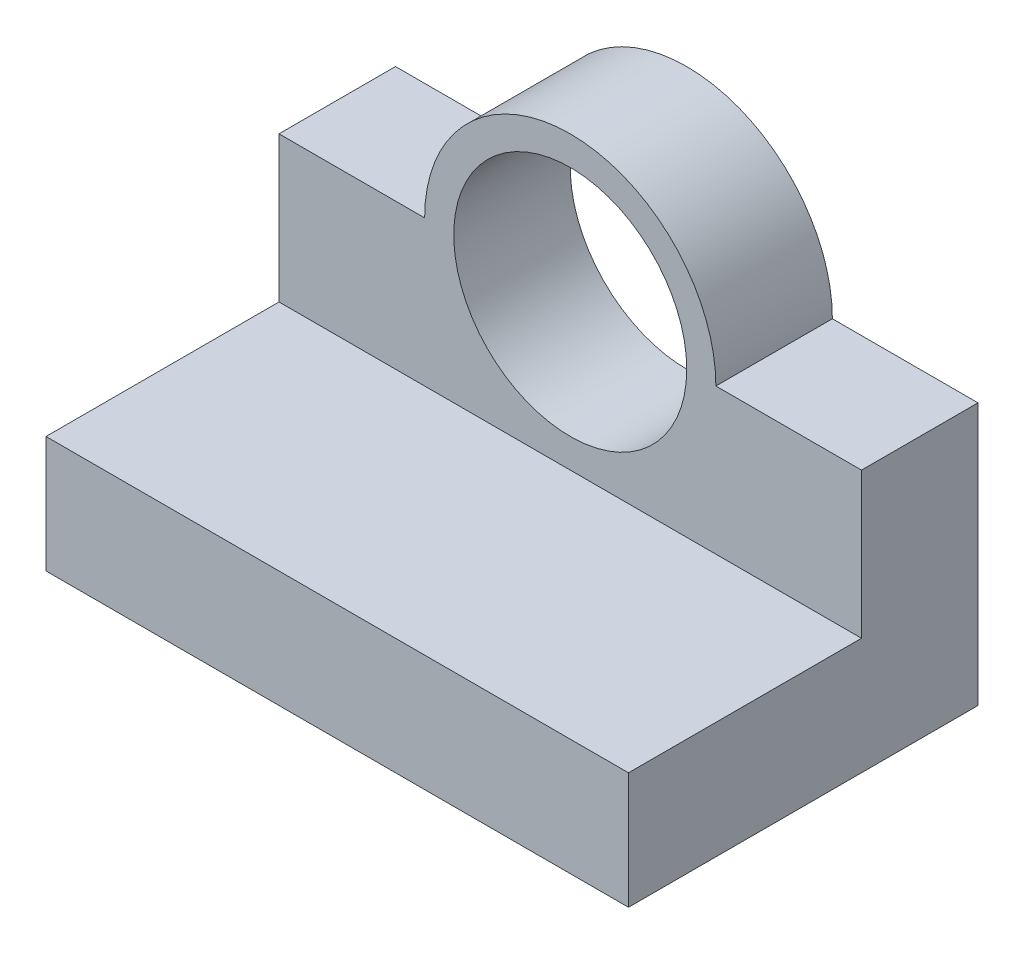
ISO-10303-21;
HEADER;
FILE_DESCRIPTION(('STEP AP214'),'2;1');
FILE_NAME('part.step','',(''),(''),'','','');
FILE_SCHEMA(('AUTOMOTIVE_DESIGN { 1 0 10303 214 1 1 1 1 }'));
ENDSEC;
DATA;
#1=APPLICATION_CONTEXT('core data for automotive mechanical design processes');
#2=APPLICATION_PROTOCOL_DEFINITION('international standard','automotive_design',2000,#1);
#3=PRODUCT_CONTEXT('',#1,'mechanical');
#4=PRODUCT('Part','Part','',(#3));
#5=PRODUCT_RELATED_PRODUCT_CATEGORY('part','',(#4));
#6=PRODUCT_DEFINITION_FORMATION('','',#4);
#7=PRODUCT_DEFINITION_CONTEXT('part definition',#1,'design');
#8=PRODUCT_DEFINITION('design','',#6,#7);
#9=PRODUCT_DEFINITION_SHAPE('','',#8);
#10=(LENGTH_UNIT() NAMED_UNIT(*) SI_UNIT(.MILLI.,.METRE.));
#11=(NAMED_UNIT(*) PLANE_ANGLE_UNIT() SI_UNIT($,.RADIAN.));
#12=(NAMED_UNIT(*) SI_UNIT($,.STERADIAN.) SOLID_ANGLE_UNIT());
#13=UNCERTAINTY_MEASURE_WITH_UNIT(LENGTH_MEASURE(1.E-05),#10,'distance_accuracy_value','');
#14=(GEOMETRIC_REPRESENTATION_CONTEXT(3) GLOBAL_UNCERTAINTY_ASSIGNED_CONTEXT((#13)) GLOBAL_UNIT_ASSIGNED_CONTEXT((#10,
#11,#12)) REPRESENTATION_CONTEXT('',''));
#15=CARTESIAN_POINT('',(0.,0.,0.));
#16=DIRECTION('',(0.,0.,1.));
#17=DIRECTION('',(1.,0.,0.));
#18=AXIS2_PLACEMENT_3D('',#15,#16,#17);
#19=CARTESIAN_POINT('',(0.,12.5,10.));
#20=DIRECTION('',(0.,0.,1.));
#21=DIRECTION('',(1.,0.,0.));
#22=AXIS2_PLACEMENT_3D('',#19,#20,#21);
#23=PLANE('',#22);
#24=DIRECTION('',(0.,1.,0.));
#25=VECTOR('',#24,1.);
#26=CARTESIAN_POINT('',(50.,-12.5,10.));
#27=LINE('',#26,#25);
#28=CARTESIAN_POINT('',(50.,-12.5,10.));
#29=VERTEX_POINT('',#28);
#30=CARTESIAN_POINT('',(50.,12.5,10.));
#31=VERTEX_POINT('',#30);
#32=EDGE_CURVE('E126',#29,#31,#27,.T.);
#33=ORIENTED_EDGE('',*,*,#32,.T.);
#34=DIRECTION('',(-1.,0.,0.));
#35=VECTOR('',#34,1.);
#36=CARTESIAN_POINT('',(25.,12.5,10.));
#37=LINE('',#36,#35);
#38=CARTESIAN_POINT('',(25.,12.5,10.));
#39=VERTEX_POINT('',#38);
#40=EDGE_CURVE('E88',#31,#39,#37,.T.);
#41=ORIENTED_EDGE('',*,*,#40,.T.);
#42=CARTESIAN_POINT('',(0.,12.5,10.));
#43=DIRECTION('',(0.,0.,1.));
#44=DIRECTION('',(1.,0.,0.));
#45=AXIS2_PLACEMENT_3D('',#42,#43,#44);
#46=CIRCLE('',#45,25.);
#47=CARTESIAN_POINT('',(-25.,12.5,10.));
#48=VERTEX_POINT('',#47);
#49=EDGE_CURVE('E96',#39,#48,#46,.T.);
#50=ORIENTED_EDGE('',*,*,#49,.T.);
#51=DIRECTION('',(-1.,0.,0.));
#52=VECTOR('',#51,1.);
#53=CARTESIAN_POINT('',(-50.,12.5,10.));
#54=LINE('',#53,#52);
#55=CARTESIAN_POINT('',(-50.,12.5,10.));
#56=VERTEX_POINT('',#55);
#57=EDGE_CURVE('E100',#48,#56,#54,.T.);
#58=ORIENTED_EDGE('',*,*,#57,.T.);
#59=DIRECTION('',(0.,-1.,0.));
#60=VECTOR('',#59,1.);
#61=CARTESIAN_POINT('',(-50.,-12.5,10.));
#62=LINE('',#61,#60);
#63=CARTESIAN_POINT('',(-50.,-12.5,10.));
#64=VERTEX_POINT('',#63);
#65=EDGE_CURVE('E108',#56,#64,#62,.T.);
#66=ORIENTED_EDGE('',*,*,#65,.T.);
#67=DIRECTION('',(1.,0.,0.));
#68=VECTOR('',#67,1.);
#69=CARTESIAN_POINT('',(-50.,-12.5,10.));
#70=LINE('',#69,#68);
#71=EDGE_CURVE('E110',#64,#29,#70,.T.);
#72=ORIENTED_EDGE('',*,*,#71,.T.);
#73=EDGE_LOOP('',(#33,#41,#50,#58,#66,#72));
#74=FACE_BOUND('',#73,.T.);
#75=CARTESIAN_POINT('',(0.,12.5,10.));
#76=DIRECTION('',(0.,0.,1.));
#77=DIRECTION('',(1.,0.,0.));
#78=AXIS2_PLACEMENT_3D('',#75,#76,#77);
#79=CIRCLE('',#78,20.);
#80=CARTESIAN_POINT('',(20.,12.5,10.));
#81=VERTEX_POINT('',#80);
#82=EDGE_CURVE('E119',#81,#81,#79,.T.);
#83=ORIENTED_EDGE('',*,*,#82,.F.);
#84=EDGE_LOOP('',(#83));
#85=FACE_BOUND('',#84,.T.);
#86=ADVANCED_FACE('F37',(#74,#85),#23,.T.);
#87=CARTESIAN_POINT('',(0.,12.5,-10.));
#88=DIRECTION('',(0.,0.,1.));
#89=DIRECTION('',(1.,0.,0.));
#90=AXIS2_PLACEMENT_3D('',#87,#88,#89);
#91=PLANE('',#90);
#92=DIRECTION('',(0.,1.,0.));
#93=VECTOR('',#92,1.);
#94=CARTESIAN_POINT('',(50.,-12.5,-10.));
#95=LINE('',#94,#93);
#96=CARTESIAN_POINT('',(50.,-32.5,-10.));
#97=VERTEX_POINT('',#96);
#98=CARTESIAN_POINT('',(50.,12.5,-10.));
#99=VERTEX_POINT('',#98);
#100=EDGE_CURVE('E115',#97,#99,#95,.T.);
#101=ORIENTED_EDGE('',*,*,#100,.F.);
#102=DIRECTION('',(1.,0.,0.));
#103=VECTOR('',#102,1.);
#104=CARTESIAN_POINT('',(-50.,-32.5,-10.));
#105=LINE('',#104,#103);
#106=CARTESIAN_POINT('',(-50.,-32.5,-10.));
#107=VERTEX_POINT('',#106);
#108=EDGE_CURVE('E135',#107,#97,#105,.T.);
#109=ORIENTED_EDGE('',*,*,#108,.F.);
#110=DIRECTION('',(0.,-1.,0.));
#111=VECTOR('',#110,1.);
#112=CARTESIAN_POINT('',(-50.,-12.5,-10.));
#113=LINE('',#112,#111);
#114=CARTESIAN_POINT('',(-50.,12.5,-10.));
#115=VERTEX_POINT('',#114);
#116=EDGE_CURVE('E123',#115,#107,#113,.T.);
#117=ORIENTED_EDGE('',*,*,#116,.F.);
#118=DIRECTION('',(-1.,0.,0.));
#119=VECTOR('',#118,1.);
#120=CARTESIAN_POINT('',(-50.,12.5,-10.));
#121=LINE('',#120,#119);
#122=CARTESIAN_POINT('',(-25.,12.5,-10.));
#123=VERTEX_POINT('',#122);
#124=EDGE_CURVE('E80',#123,#115,#121,.T.);
#125=ORIENTED_EDGE('',*,*,#124,.F.);
#126=CARTESIAN_POINT('',(0.,12.5,-10.));
#127=DIRECTION('',(0.,0.,1.));
#128=DIRECTION('',(1.,0.,0.));
#129=AXIS2_PLACEMENT_3D('',#126,#127,#128);
#130=CIRCLE('',#129,25.);
#131=CARTESIAN_POINT('',(25.,12.5,-10.));
#132=VERTEX_POINT('',#131);
#133=EDGE_CURVE('E73',#132,#123,#130,.T.);
#134=ORIENTED_EDGE('',*,*,#133,.F.);
#135=DIRECTION('',(-1.,0.,0.));
#136=VECTOR('',#135,1.);
#137=CARTESIAN_POINT('',(25.,12.5,-10.));
#138=LINE('',#137,#136);
#139=EDGE_CURVE('E118',#99,#132,#138,.T.);
#140=ORIENTED_EDGE('',*,*,#139,.F.);
#141=EDGE_LOOP('',(#101,#109,#117,#125,#134,#140));
#142=FACE_BOUND('',#141,.T.);
#143=CARTESIAN_POINT('',(0.,12.5,-10.));
#144=DIRECTION('',(0.,0.,1.));
#145=DIRECTION('',(1.,0.,0.));
#146=AXIS2_PLACEMENT_3D('',#143,#144,#145);
#147=CIRCLE('',#146,20.);
#148=CARTESIAN_POINT('',(20.,12.5,-10.));
#149=VERTEX_POINT('',#148);
#150=EDGE_CURVE('E182',#149,#149,#147,.T.);
#151=ORIENTED_EDGE('',*,*,#150,.T.);
#152=EDGE_LOOP('',(#151));
#153=FACE_BOUND('',#152,.T.);
#154=ADVANCED_FACE('F129',(#142,#153),#91,.F.);
#155=CARTESIAN_POINT('',(50.,-12.5,10.));
#156=DIRECTION('',(-1.,0.,0.));
#157=DIRECTION('',(0.,0.,1.));
#158=AXIS2_PLACEMENT_3D('',#155,#156,#157);
#159=PLANE('',#158);
#160=ORIENTED_EDGE('',*,*,#100,.T.);
#161=DIRECTION('',(0.,0.,-1.));
#162=VECTOR('',#161,1.);
#163=CARTESIAN_POINT('',(50.,12.5,10.));
#164=LINE('',#163,#162);
#165=EDGE_CURVE('E11',#31,#99,#164,.T.);
#166=ORIENTED_EDGE('',*,*,#165,.F.);
#167=ORIENTED_EDGE('',*,*,#32,.F.);
#168=DIRECTION('',(0.,0.,-1.));
#169=VECTOR('',#168,1.);
#170=CARTESIAN_POINT('',(50.,-12.5,50.));
#171=LINE('',#170,#169);
#172=CARTESIAN_POINT('',(50.,-12.5,50.));
#173=VERTEX_POINT('',#172);
#174=EDGE_CURVE('E54',#173,#29,#171,.T.);
#175=ORIENTED_EDGE('',*,*,#174,.F.);
#176=DIRECTION('',(0.,1.,0.));
#177=VECTOR('',#176,1.);
#178=CARTESIAN_POINT('',(50.,-12.5,50.));
#179=LINE('',#178,#177);
#180=CARTESIAN_POINT('',(50.,-32.5,50.));
#181=VERTEX_POINT('',#180);
#182=EDGE_CURVE('E165',#181,#173,#179,.T.);
#183=ORIENTED_EDGE('',*,*,#182,.F.);
#184=DIRECTION('',(0.,0.,-1.));
#185=VECTOR('',#184,1.);
#186=CARTESIAN_POINT('',(50.,-32.5,50.));
#187=LINE('',#186,#185);
#188=EDGE_CURVE('E162',#181,#97,#187,.T.);
#189=ORIENTED_EDGE('',*,*,#188,.T.);
#190=EDGE_LOOP('',(#160,#166,#167,#175,#183,#189));
#191=FACE_BOUND('',#190,.T.);
#192=ADVANCED_FACE('F39',(#191),#159,.F.);
#193=CARTESIAN_POINT('',(25.,12.5,10.));
#194=DIRECTION('',(0.,-1.,0.));
#195=DIRECTION('',(0.,0.,-1.));
#196=AXIS2_PLACEMENT_3D('',#193,#194,#195);
#197=PLANE('',#196);
#198=ORIENTED_EDGE('',*,*,#139,.T.);
#199=DIRECTION('',(0.,0.,-1.));
#200=VECTOR('',#199,1.);
#201=CARTESIAN_POINT('',(25.,12.5,10.));
#202=LINE('',#201,#200);
#203=EDGE_CURVE('E46',#39,#132,#202,.T.);
#204=ORIENTED_EDGE('',*,*,#203,.F.);
#205=ORIENTED_EDGE('',*,*,#40,.F.);
#206=ORIENTED_EDGE('',*,*,#165,.T.);
#207=EDGE_LOOP('',(#198,#204,#205,#206));
#208=FACE_BOUND('',#207,.T.);
#209=ADVANCED_FACE('F190',(#208),#197,.F.);
#210=CARTESIAN_POINT('',(0.,12.5,10.));
#211=DIRECTION('',(0.,0.,-1.));
#212=DIRECTION('',(-1.,0.,0.));
#213=AXIS2_PLACEMENT_3D('',#210,#211,#212);
#214=CYLINDRICAL_SURFACE('',#213,25.);
#215=ORIENTED_EDGE('',*,*,#133,.T.);
#216=DIRECTION('',(0.,0.,-1.));
#217=VECTOR('',#216,1.);
#218=CARTESIAN_POINT('',(-25.,12.5,10.));
#219=LINE('',#218,#217);
#220=EDGE_CURVE('E102',#48,#123,#219,.T.);
#221=ORIENTED_EDGE('',*,*,#220,.F.);
#222=ORIENTED_EDGE('',*,*,#49,.F.);
#223=ORIENTED_EDGE('',*,*,#203,.T.);
#224=EDGE_LOOP('',(#215,#221,#222,#223));
#225=FACE_BOUND('',#224,.T.);
#226=ADVANCED_FACE('F103',(#225),#214,.T.);
#227=CARTESIAN_POINT('',(-50.,12.5,10.));
#228=DIRECTION('',(0.,-1.,0.));
#229=DIRECTION('',(0.,0.,-1.));
#230=AXIS2_PLACEMENT_3D('',#227,#228,#229);
#231=PLANE('',#230);
#232=ORIENTED_EDGE('',*,*,#124,.T.);
#233=DIRECTION('',(0.,0.,-1.));
#234=VECTOR('',#233,1.);
#235=CARTESIAN_POINT('',(-50.,12.5,10.));
#236=LINE('',#235,#234);
#237=EDGE_CURVE('E104',#56,#115,#236,.T.);
#238=ORIENTED_EDGE('',*,*,#237,.F.);
#239=ORIENTED_EDGE('',*,*,#57,.F.);
#240=ORIENTED_EDGE('',*,*,#220,.T.);
#241=EDGE_LOOP('',(#232,#238,#239,#240));
#242=FACE_BOUND('',#241,.T.);
#243=ADVANCED_FACE('F106',(#242),#231,.F.);
#244=CARTESIAN_POINT('',(-50.,-12.5,10.));
#245=DIRECTION('',(1.,0.,0.));
#246=DIRECTION('',(0.,0.,-1.));
#247=AXIS2_PLACEMENT_3D('',#244,#245,#246);
#248=PLANE('',#247);
#249=ORIENTED_EDGE('',*,*,#116,.T.);
#250=DIRECTION('',(0.,0.,-1.));
#251=VECTOR('',#250,1.);
#252=CARTESIAN_POINT('',(-50.,-32.5,50.));
#253=LINE('',#252,#251);
#254=CARTESIAN_POINT('',(-50.,-32.5,50.));
#255=VERTEX_POINT('',#254);
#256=EDGE_CURVE('E142',#255,#107,#253,.T.);
#257=ORIENTED_EDGE('',*,*,#256,.F.);
#258=DIRECTION('',(0.,-1.,0.));
#259=VECTOR('',#258,1.);
#260=CARTESIAN_POINT('',(-50.,-12.5,50.));
#261=LINE('',#260,#259);
#262=CARTESIAN_POINT('',(-50.,-12.5,50.));
#263=VERTEX_POINT('',#262);
#264=EDGE_CURVE('E166',#263,#255,#261,.T.);
#265=ORIENTED_EDGE('',*,*,#264,.F.);
#266=DIRECTION('',(0.,0.,-1.));
#267=VECTOR('',#266,1.);
#268=CARTESIAN_POINT('',(-50.,-12.5,50.));
#269=LINE('',#268,#267);
#270=EDGE_CURVE('E176',#263,#64,#269,.T.);
#271=ORIENTED_EDGE('',*,*,#270,.T.);
#272=ORIENTED_EDGE('',*,*,#65,.F.);
#273=ORIENTED_EDGE('',*,*,#237,.T.);
#274=EDGE_LOOP('',(#249,#257,#265,#271,#272,#273));
#275=FACE_BOUND('',#274,.T.);
#276=ADVANCED_FACE('F139',(#275),#248,.F.);
#277=CARTESIAN_POINT('',(0.,12.5,10.));
#278=DIRECTION('',(0.,0.,-1.));
#279=DIRECTION('',(-1.,0.,0.));
#280=AXIS2_PLACEMENT_3D('',#277,#278,#279);
#281=CYLINDRICAL_SURFACE('',#280,20.);
#282=ORIENTED_EDGE('',*,*,#82,.T.);
#283=EDGE_LOOP('',(#282));
#284=FACE_BOUND('',#283,.T.);
#285=ORIENTED_EDGE('',*,*,#150,.F.);
#286=EDGE_LOOP('',(#285));
#287=FACE_BOUND('',#286,.T.);
#288=ADVANCED_FACE('F204',(#284,#287),#281,.F.);
#289=CARTESIAN_POINT('',(-50.,-32.5,50.));
#290=DIRECTION('',(0.,1.,0.));
#291=DIRECTION('',(0.,0.,1.));
#292=AXIS2_PLACEMENT_3D('',#289,#290,#291);
#293=PLANE('',#292);
#294=ORIENTED_EDGE('',*,*,#108,.T.);
#295=ORIENTED_EDGE('',*,*,#188,.F.);
#296=DIRECTION('',(1.,0.,0.));
#297=VECTOR('',#296,1.);
#298=CARTESIAN_POINT('',(-50.,-32.5,50.));
#299=LINE('',#298,#297);
#300=EDGE_CURVE('E158',#255,#181,#299,.T.);
#301=ORIENTED_EDGE('',*,*,#300,.F.);
#302=ORIENTED_EDGE('',*,*,#256,.T.);
#303=EDGE_LOOP('',(#294,#295,#301,#302));
#304=FACE_BOUND('',#303,.T.);
#305=ADVANCED_FACE('F160',(#304),#293,.F.);
#306=CARTESIAN_POINT('',(-50.,-12.5,50.));
#307=DIRECTION('',(0.,-1.,0.));
#308=DIRECTION('',(0.,0.,-1.));
#309=AXIS2_PLACEMENT_3D('',#306,#307,#308);
#310=PLANE('',#309);
#311=ORIENTED_EDGE('',*,*,#71,.F.);
#312=ORIENTED_EDGE('',*,*,#270,.F.);
#313=DIRECTION('',(-1.,0.,0.));
#314=VECTOR('',#313,1.);
#315=CARTESIAN_POINT('',(-50.,-12.5,50.));
#316=LINE('',#315,#314);
#317=EDGE_CURVE('E169',#173,#263,#316,.T.);
#318=ORIENTED_EDGE('',*,*,#317,.F.);
#319=ORIENTED_EDGE('',*,*,#174,.T.);
#320=EDGE_LOOP('',(#311,#312,#318,#319));
#321=FACE_BOUND('',#320,.T.);
#322=ADVANCED_FACE('F231',(#321),#310,.F.);
#323=CARTESIAN_POINT('',(0.,0.,50.));
#324=DIRECTION('',(0.,0.,1.));
#325=DIRECTION('',(1.,0.,0.));
#326=AXIS2_PLACEMENT_3D('',#323,#324,#325);
#327=PLANE('',#326);
#328=ORIENTED_EDGE('',*,*,#264,.T.);
#329=ORIENTED_EDGE('',*,*,#300,.T.);
#330=ORIENTED_EDGE('',*,*,#182,.T.);
#331=ORIENTED_EDGE('',*,*,#317,.T.);
#332=EDGE_LOOP('',(#328,#329,#330,#331));
#333=FACE_BOUND('',#332,.T.);
#334=ADVANCED_FACE('F168',(#333),#327,.T.);
#335=CLOSED_SHELL('',(#86,#154,#192,#209,#226,#243,#276,#288,#305,#322,#334));
#336=MANIFOLD_SOLID_BREP('B2',#335);
#337=ADVANCED_BREP_SHAPE_REPRESENTATION('',(#18,#336),#14);
#338=SHAPE_DEFINITION_REPRESENTATION(#9,#337);
ENDSEC;
END-ISO-10303-21;
